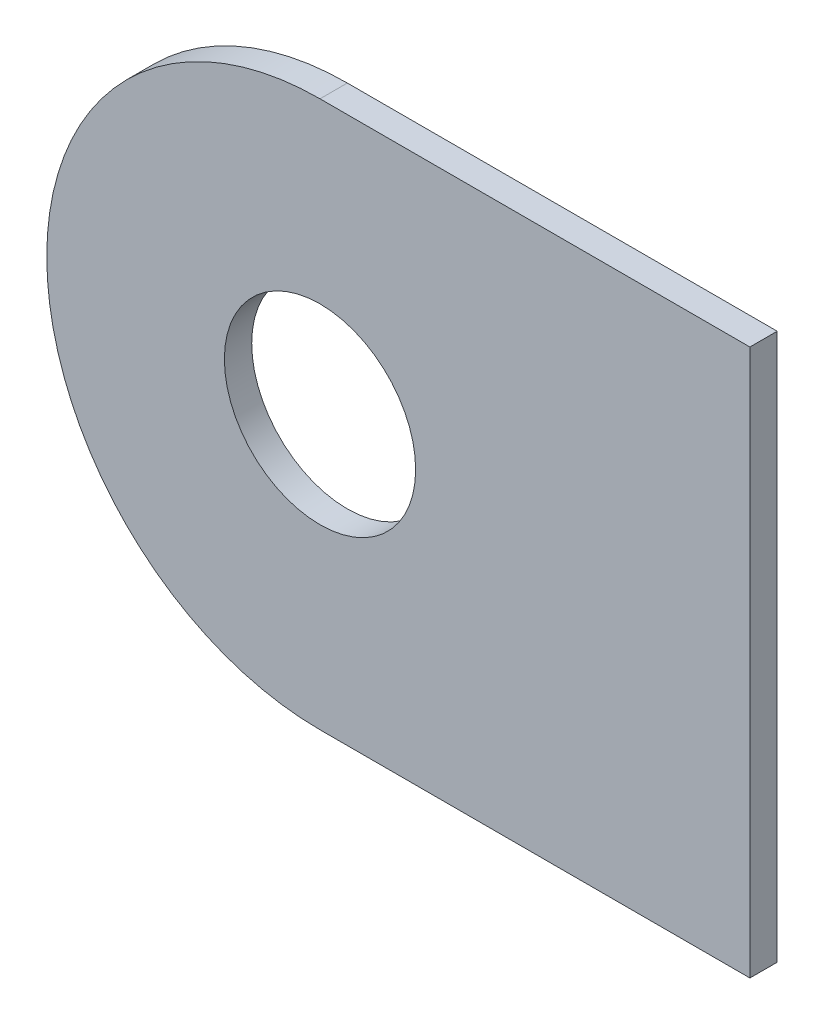
ISO-10303-21;
HEADER;
FILE_DESCRIPTION(('STEP AP214'),'2;1');
FILE_NAME('part.step','',(''),(''),'','','');
FILE_SCHEMA(('AUTOMOTIVE_DESIGN { 1 0 10303 214 1 1 1 1 }'));
ENDSEC;
DATA;
#1=APPLICATION_CONTEXT('core data for automotive mechanical design processes');
#2=APPLICATION_PROTOCOL_DEFINITION('international standard','automotive_design',2000,#1);
#3=PRODUCT_CONTEXT('',#1,'mechanical');
#4=PRODUCT('Part','Part','',(#3));
#5=PRODUCT_RELATED_PRODUCT_CATEGORY('part','',(#4));
#6=PRODUCT_DEFINITION_FORMATION('','',#4);
#7=PRODUCT_DEFINITION_CONTEXT('part definition',#1,'design');
#8=PRODUCT_DEFINITION('design','',#6,#7);
#9=PRODUCT_DEFINITION_SHAPE('','',#8);
#10=(LENGTH_UNIT() NAMED_UNIT(*) SI_UNIT(.MILLI.,.METRE.));
#11=(NAMED_UNIT(*) PLANE_ANGLE_UNIT() SI_UNIT($,.RADIAN.));
#12=(NAMED_UNIT(*) SI_UNIT($,.STERADIAN.) SOLID_ANGLE_UNIT());
#13=UNCERTAINTY_MEASURE_WITH_UNIT(LENGTH_MEASURE(1.E-05),#10,'distance_accuracy_value','');
#14=(GEOMETRIC_REPRESENTATION_CONTEXT(3) GLOBAL_UNCERTAINTY_ASSIGNED_CONTEXT((#13)) GLOBAL_UNIT_ASSIGNED_CONTEXT((#10,
#11,#12)) REPRESENTATION_CONTEXT('',''));
#15=CARTESIAN_POINT('',(0.,0.,0.));
#16=DIRECTION('',(0.,0.,1.));
#17=DIRECTION('',(1.,0.,0.));
#18=AXIS2_PLACEMENT_3D('',#15,#16,#17);
#19=CARTESIAN_POINT('',(0.,0.,-3.64));
#20=DIRECTION('',(0.,0.,-1.));
#21=DIRECTION('',(0.,1.,0.));
#22=AXIS2_PLACEMENT_3D('',#19,#20,#21);
#23=PLANE('',#22);
#24=DIRECTION('',(1.,0.,0.));
#25=VECTOR('',#24,1.);
#26=CARTESIAN_POINT('',(11.8,-15.,-3.64));
#27=LINE('',#26,#25);
#28=CARTESIAN_POINT('',(0.,-15.,-3.64));
#29=VERTEX_POINT('',#28);
#30=CARTESIAN_POINT('',(23.6,-15.,-3.64));
#31=VERTEX_POINT('',#30);
#32=EDGE_CURVE('E57',#29,#31,#27,.T.);
#33=ORIENTED_EDGE('',*,*,#32,.F.);
#34=CARTESIAN_POINT('',(0.,0.,-3.64));
#35=DIRECTION('',(0.,0.,-1.));
#36=DIRECTION('',(0.,1.,0.));
#37=AXIS2_PLACEMENT_3D('',#34,#35,#36);
#38=CIRCLE('',#37,15.);
#39=CARTESIAN_POINT('',(0.,15.,-3.64));
#40=VERTEX_POINT('',#39);
#41=EDGE_CURVE('E52',#40,#29,#38,.F.);
#42=ORIENTED_EDGE('',*,*,#41,.F.);
#43=DIRECTION('',(1.,0.,0.));
#44=VECTOR('',#43,1.);
#45=CARTESIAN_POINT('',(11.8,15.,-3.64));
#46=LINE('',#45,#44);
#47=CARTESIAN_POINT('',(23.6,15.,-3.64));
#48=VERTEX_POINT('',#47);
#49=EDGE_CURVE('E100',#48,#40,#46,.F.);
#50=ORIENTED_EDGE('',*,*,#49,.F.);
#51=DIRECTION('',(0.,1.,0.));
#52=VECTOR('',#51,1.);
#53=CARTESIAN_POINT('',(23.6,0.,-3.64));
#54=LINE('',#53,#52);
#55=EDGE_CURVE('E69',#31,#48,#54,.T.);
#56=ORIENTED_EDGE('',*,*,#55,.F.);
#57=EDGE_LOOP('',(#33,#42,#50,#56));
#58=FACE_BOUND('',#57,.T.);
#59=CARTESIAN_POINT('',(0.,0.,-3.64));
#60=DIRECTION('',(0.,0.,-1.));
#61=DIRECTION('',(0.,1.,0.));
#62=AXIS2_PLACEMENT_3D('',#59,#60,#61);
#63=CIRCLE('',#62,5.25);
#64=CARTESIAN_POINT('',(0.,5.25000000000003,-3.64000000000002));
#65=VERTEX_POINT('',#64);
#66=EDGE_CURVE('E20',#65,#65,#63,.F.);
#67=ORIENTED_EDGE('',*,*,#66,.T.);
#68=EDGE_LOOP('',(#67));
#69=FACE_BOUND('',#68,.T.);
#70=ADVANCED_FACE('F17',(#58,#69),#23,.T.);
#71=CARTESIAN_POINT('',(0.,0.,-13.8));
#72=DIRECTION('',(0.,0.,-1.));
#73=DIRECTION('',(0.,1.,0.));
#74=AXIS2_PLACEMENT_3D('',#71,#72,#73);
#75=CYLINDRICAL_SURFACE('',#74,5.25);
#76=CARTESIAN_POINT('',(0.,0.,-2.14));
#77=DIRECTION('',(0.,0.,-1.));
#78=DIRECTION('',(0.,1.,0.));
#79=AXIS2_PLACEMENT_3D('',#76,#77,#78);
#80=CIRCLE('',#79,5.25);
#81=CARTESIAN_POINT('',(0.,5.25000000000004,-2.14000000000002));
#82=VERTEX_POINT('',#81);
#83=EDGE_CURVE('E82',#82,#82,#80,.F.);
#84=ORIENTED_EDGE('',*,*,#83,.T.);
#85=EDGE_LOOP('',(#84));
#86=FACE_BOUND('',#85,.T.);
#87=ORIENTED_EDGE('',*,*,#66,.F.);
#88=EDGE_LOOP('',(#87));
#89=FACE_BOUND('',#88,.T.);
#90=ADVANCED_FACE('F113',(#86,#89),#75,.F.);
#91=CARTESIAN_POINT('',(11.8,15.,-2.14));
#92=DIRECTION('',(0.,1.,0.));
#93=DIRECTION('',(0.,0.,1.));
#94=AXIS2_PLACEMENT_3D('',#91,#92,#93);
#95=PLANE('',#94);
#96=DIRECTION('',(1.,0.,0.));
#97=VECTOR('',#96,1.);
#98=CARTESIAN_POINT('',(0.,15.,-2.14));
#99=LINE('',#98,#97);
#100=CARTESIAN_POINT('',(0.,15.,-2.14));
#101=VERTEX_POINT('',#100);
#102=CARTESIAN_POINT('',(23.6,15.,-2.14));
#103=VERTEX_POINT('',#102);
#104=EDGE_CURVE('E77',#101,#103,#99,.T.);
#105=ORIENTED_EDGE('',*,*,#104,.T.);
#106=DIRECTION('',(0.,0.,-1.));
#107=VECTOR('',#106,1.);
#108=CARTESIAN_POINT('',(23.6,15.,-2.14));
#109=LINE('',#108,#107);
#110=EDGE_CURVE('E65',#48,#103,#109,.F.);
#111=ORIENTED_EDGE('',*,*,#110,.F.);
#112=ORIENTED_EDGE('',*,*,#49,.T.);
#113=DIRECTION('',(0.,0.,1.));
#114=VECTOR('',#113,1.);
#115=CARTESIAN_POINT('',(0.,15.,-2.14));
#116=LINE('',#115,#114);
#117=EDGE_CURVE('E80',#40,#101,#116,.T.);
#118=ORIENTED_EDGE('',*,*,#117,.T.);
#119=EDGE_LOOP('',(#105,#111,#112,#118));
#120=FACE_BOUND('',#119,.T.);
#121=ADVANCED_FACE('F79',(#120),#95,.T.);
#122=CARTESIAN_POINT('',(23.6,0.,-2.14));
#123=DIRECTION('',(1.,0.,0.));
#124=DIRECTION('',(0.,0.,-1.));
#125=AXIS2_PLACEMENT_3D('',#122,#123,#124);
#126=PLANE('',#125);
#127=DIRECTION('',(0.,1.,0.));
#128=VECTOR('',#127,1.);
#129=CARTESIAN_POINT('',(23.6,0.,-2.14));
#130=LINE('',#129,#128);
#131=CARTESIAN_POINT('',(23.6,-15.,-2.14));
#132=VERTEX_POINT('',#131);
#133=EDGE_CURVE('E26',#103,#132,#130,.F.);
#134=ORIENTED_EDGE('',*,*,#133,.T.);
#135=DIRECTION('',(0.,0.,-1.));
#136=VECTOR('',#135,1.);
#137=CARTESIAN_POINT('',(23.6,-15.,-2.14));
#138=LINE('',#137,#136);
#139=EDGE_CURVE('E91',#31,#132,#138,.F.);
#140=ORIENTED_EDGE('',*,*,#139,.F.);
#141=ORIENTED_EDGE('',*,*,#55,.T.);
#142=ORIENTED_EDGE('',*,*,#110,.T.);
#143=EDGE_LOOP('',(#134,#140,#141,#142));
#144=FACE_BOUND('',#143,.T.);
#145=ADVANCED_FACE('F67',(#144),#126,.T.);
#146=CARTESIAN_POINT('',(11.8,-15.,-2.14));
#147=DIRECTION('',(0.,-1.,0.));
#148=DIRECTION('',(0.,0.,-1.));
#149=AXIS2_PLACEMENT_3D('',#146,#147,#148);
#150=PLANE('',#149);
#151=DIRECTION('',(1.,0.,0.));
#152=VECTOR('',#151,1.);
#153=CARTESIAN_POINT('',(0.,-15.,-2.14));
#154=LINE('',#153,#152);
#155=CARTESIAN_POINT('',(0.,-15.,-2.14));
#156=VERTEX_POINT('',#155);
#157=EDGE_CURVE('E11',#132,#156,#154,.F.);
#158=ORIENTED_EDGE('',*,*,#157,.T.);
#159=DIRECTION('',(0.,0.,-1.));
#160=VECTOR('',#159,1.);
#161=CARTESIAN_POINT('',(0.,-15.,-2.14));
#162=LINE('',#161,#160);
#163=EDGE_CURVE('E89',#29,#156,#162,.F.);
#164=ORIENTED_EDGE('',*,*,#163,.F.);
#165=ORIENTED_EDGE('',*,*,#32,.T.);
#166=ORIENTED_EDGE('',*,*,#139,.T.);
#167=EDGE_LOOP('',(#158,#164,#165,#166));
#168=FACE_BOUND('',#167,.T.);
#169=ADVANCED_FACE('F122',(#168),#150,.T.);
#170=CARTESIAN_POINT('',(0.,0.,-2.14));
#171=DIRECTION('',(0.,0.,-1.));
#172=DIRECTION('',(0.,1.,0.));
#173=AXIS2_PLACEMENT_3D('',#170,#171,#172);
#174=CYLINDRICAL_SURFACE('',#173,15.);
#175=ORIENTED_EDGE('',*,*,#163,.T.);
#176=CARTESIAN_POINT('',(0.,0.,-2.14));
#177=DIRECTION('',(0.,0.,-1.));
#178=DIRECTION('',(0.,1.,0.));
#179=AXIS2_PLACEMENT_3D('',#176,#177,#178);
#180=CIRCLE('',#179,15.);
#181=EDGE_CURVE('E35',#156,#101,#180,.T.);
#182=ORIENTED_EDGE('',*,*,#181,.T.);
#183=ORIENTED_EDGE('',*,*,#117,.F.);
#184=ORIENTED_EDGE('',*,*,#41,.T.);
#185=EDGE_LOOP('',(#175,#182,#183,#184));
#186=FACE_BOUND('',#185,.T.);
#187=ADVANCED_FACE('F116',(#186),#174,.T.);
#188=CARTESIAN_POINT('',(0.,0.,-2.14));
#189=DIRECTION('',(0.,0.,-1.));
#190=DIRECTION('',(0.,1.,0.));
#191=AXIS2_PLACEMENT_3D('',#188,#189,#190);
#192=PLANE('',#191);
#193=ORIENTED_EDGE('',*,*,#157,.F.);
#194=ORIENTED_EDGE('',*,*,#133,.F.);
#195=ORIENTED_EDGE('',*,*,#104,.F.);
#196=ORIENTED_EDGE('',*,*,#181,.F.);
#197=EDGE_LOOP('',(#193,#194,#195,#196));
#198=FACE_BOUND('',#197,.T.);
#199=ORIENTED_EDGE('',*,*,#83,.F.);
#200=EDGE_LOOP('',(#199));
#201=FACE_BOUND('',#200,.T.);
#202=ADVANCED_FACE('F75',(#198,#201),#192,.F.);
#203=CLOSED_SHELL('',(#70,#90,#121,#145,#169,#187,#202));
#204=MANIFOLD_SOLID_BREP('B1',#203);
#205=ADVANCED_BREP_SHAPE_REPRESENTATION('',(#18,#204),#14);
#206=SHAPE_DEFINITION_REPRESENTATION(#9,#205);
ENDSEC;
END-ISO-10303-21;
